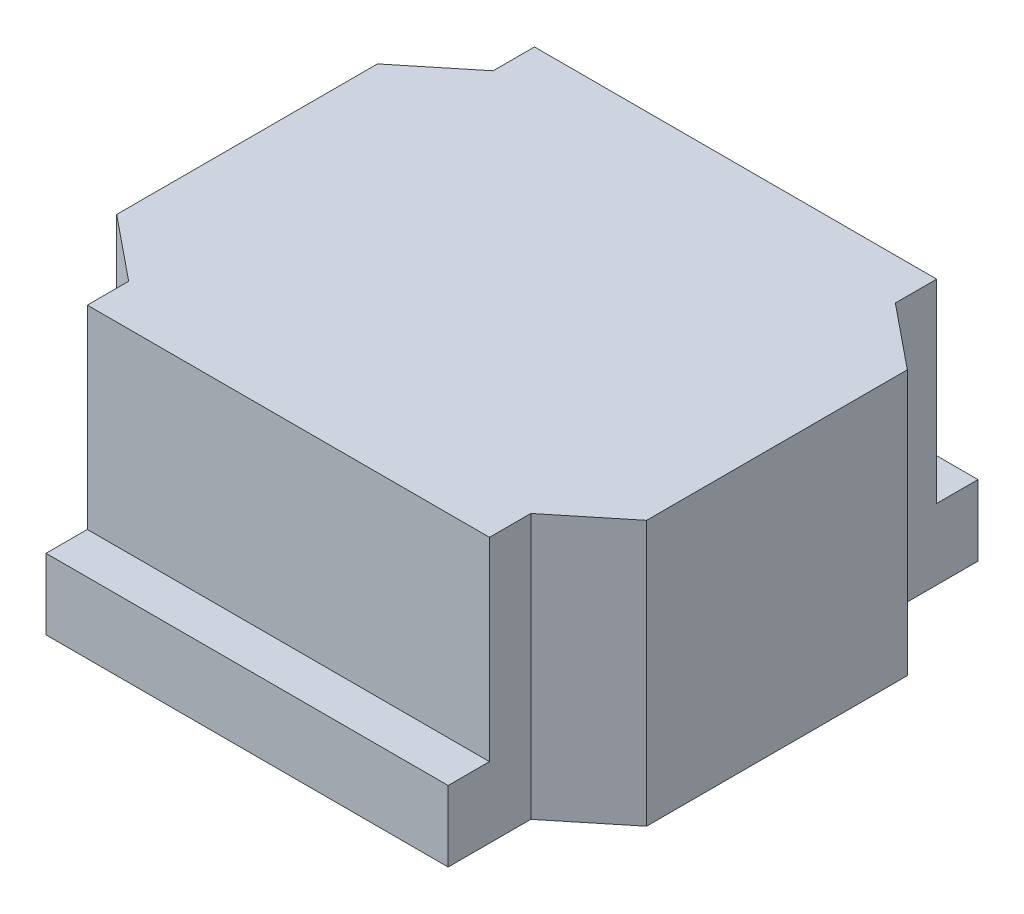
ISO-10303-21;
HEADER;
FILE_DESCRIPTION(('STEP AP214'),'2;1');
FILE_NAME('part.step','',(''),(''),'','','');
FILE_SCHEMA(('AUTOMOTIVE_DESIGN { 1 0 10303 214 1 1 1 1 }'));
ENDSEC;
DATA;
#1=APPLICATION_CONTEXT('core data for automotive mechanical design processes');
#2=APPLICATION_PROTOCOL_DEFINITION('international standard','automotive_design',2000,#1);
#3=PRODUCT_CONTEXT('',#1,'mechanical');
#4=PRODUCT('Part','Part','',(#3));
#5=PRODUCT_RELATED_PRODUCT_CATEGORY('part','',(#4));
#6=PRODUCT_DEFINITION_FORMATION('','',#4);
#7=PRODUCT_DEFINITION_CONTEXT('part definition',#1,'design');
#8=PRODUCT_DEFINITION('design','',#6,#7);
#9=PRODUCT_DEFINITION_SHAPE('','',#8);
#10=(LENGTH_UNIT() NAMED_UNIT(*) SI_UNIT(.MILLI.,.METRE.));
#11=(NAMED_UNIT(*) PLANE_ANGLE_UNIT() SI_UNIT($,.RADIAN.));
#12=(NAMED_UNIT(*) SI_UNIT($,.STERADIAN.) SOLID_ANGLE_UNIT());
#13=UNCERTAINTY_MEASURE_WITH_UNIT(LENGTH_MEASURE(1.E-05),#10,'distance_accuracy_value','');
#14=(GEOMETRIC_REPRESENTATION_CONTEXT(3) GLOBAL_UNCERTAINTY_ASSIGNED_CONTEXT((#13)) GLOBAL_UNIT_ASSIGNED_CONTEXT((#10,
#11,#12)) REPRESENTATION_CONTEXT('',''));
#15=CARTESIAN_POINT('',(0.,0.,0.));
#16=DIRECTION('',(0.,0.,1.));
#17=DIRECTION('',(1.,0.,0.));
#18=AXIS2_PLACEMENT_3D('',#15,#16,#17);
#19=CARTESIAN_POINT('',(0.,1.5,0.));
#20=DIRECTION('',(0.,1.,0.));
#21=DIRECTION('',(0.,0.,1.));
#22=AXIS2_PLACEMENT_3D('',#19,#20,#21);
#23=PLANE('',#22);
#24=DIRECTION('',(-0.776051768896071,0.,0.630669209644231));
#25=VECTOR('',#24,1.);
#26=CARTESIAN_POINT('',(-1.138546216739,1.5,-1.03198911933));
#27=LINE('',#26,#25);
#28=CARTESIAN_POINT('',(-1.13854621673901,1.5,-1.03198911933001));
#29=VERTEX_POINT('',#28);
#30=CARTESIAN_POINT('',(-1.5,1.5,-0.7382487002644));
#31=VERTEX_POINT('',#30);
#32=EDGE_CURVE('E136',#29,#31,#27,.T.);
#33=ORIENTED_EDGE('',*,*,#32,.T.);
#34=DIRECTION('',(0.,0.,1.));
#35=VECTOR('',#34,1.);
#36=CARTESIAN_POINT('',(-1.5,1.5,0.));
#37=LINE('',#36,#35);
#38=CARTESIAN_POINT('',(-1.49999999999999,1.5,0.738248700264391));
#39=VERTEX_POINT('',#38);
#40=EDGE_CURVE('E130',#31,#39,#37,.T.);
#41=ORIENTED_EDGE('',*,*,#40,.T.);
#42=DIRECTION('',(0.776051768896071,0.,0.630669209644231));
#43=VECTOR('',#42,1.);
#44=CARTESIAN_POINT('',(-1.5,1.5,0.7382487002644));
#45=LINE('',#44,#43);
#46=CARTESIAN_POINT('',(-1.138546216739,1.5,1.03198911933));
#47=VERTEX_POINT('',#46);
#48=EDGE_CURVE('E20',#39,#47,#45,.T.);
#49=ORIENTED_EDGE('',*,*,#48,.T.);
#50=DIRECTION('',(0.,0.,-1.));
#51=VECTOR('',#50,1.);
#52=CARTESIAN_POINT('',(-1.138546216739,1.5,1.5));
#53=LINE('',#52,#51);
#54=CARTESIAN_POINT('',(-1.138546216739,1.5,1.265994559665));
#55=VERTEX_POINT('',#54);
#56=EDGE_CURVE('E140',#47,#55,#53,.F.);
#57=ORIENTED_EDGE('',*,*,#56,.T.);
#58=DIRECTION('',(1.,0.,0.));
#59=VECTOR('',#58,1.);
#60=CARTESIAN_POINT('',(-1.138546216739,1.5,1.265994559665));
#61=LINE('',#60,#59);
#62=CARTESIAN_POINT('',(1.138546216739,1.5,1.265994559665));
#63=VERTEX_POINT('',#62);
#64=EDGE_CURVE('E182',#63,#55,#61,.F.);
#65=ORIENTED_EDGE('',*,*,#64,.F.);
#66=DIRECTION('',(0.,0.,1.));
#67=VECTOR('',#66,1.);
#68=CARTESIAN_POINT('',(1.138546216739,1.5,1.03198911933));
#69=LINE('',#68,#67);
#70=CARTESIAN_POINT('',(1.13854621673901,1.5,1.03198911933001));
#71=VERTEX_POINT('',#70);
#72=EDGE_CURVE('E201',#63,#71,#69,.F.);
#73=ORIENTED_EDGE('',*,*,#72,.T.);
#74=DIRECTION('',(0.776051768896071,0.,-0.630669209644231));
#75=VECTOR('',#74,1.);
#76=CARTESIAN_POINT('',(1.138546216739,1.5,1.03198911933));
#77=LINE('',#76,#75);
#78=CARTESIAN_POINT('',(1.5,1.5,0.7382487002644));
#79=VERTEX_POINT('',#78);
#80=EDGE_CURVE('E126',#71,#79,#77,.T.);
#81=ORIENTED_EDGE('',*,*,#80,.T.);
#82=DIRECTION('',(0.,0.,1.));
#83=VECTOR('',#82,1.);
#84=CARTESIAN_POINT('',(1.5,1.5,0.));
#85=LINE('',#84,#83);
#86=CARTESIAN_POINT('',(1.49999999999999,1.5,-0.738248700264391));
#87=VERTEX_POINT('',#86);
#88=EDGE_CURVE('E157',#79,#87,#85,.F.);
#89=ORIENTED_EDGE('',*,*,#88,.T.);
#90=DIRECTION('',(-0.776051768896071,0.,-0.630669209644231));
#91=VECTOR('',#90,1.);
#92=CARTESIAN_POINT('',(1.5,1.5,-0.7382487002644));
#93=LINE('',#92,#91);
#94=CARTESIAN_POINT('',(1.138546216739,1.5,-1.03198911933));
#95=VERTEX_POINT('',#94);
#96=EDGE_CURVE('E158',#87,#95,#93,.T.);
#97=ORIENTED_EDGE('',*,*,#96,.T.);
#98=DIRECTION('',(0.,0.,1.));
#99=VECTOR('',#98,1.);
#100=CARTESIAN_POINT('',(1.138546216739,1.5,-1.5));
#101=LINE('',#100,#99);
#102=CARTESIAN_POINT('',(1.138546216739,1.5,-1.265994559665));
#103=VERTEX_POINT('',#102);
#104=EDGE_CURVE('E187',#95,#103,#101,.F.);
#105=ORIENTED_EDGE('',*,*,#104,.T.);
#106=DIRECTION('',(-1.,0.,0.));
#107=VECTOR('',#106,1.);
#108=CARTESIAN_POINT('',(1.138546216739,1.5,-1.265994559665));
#109=LINE('',#108,#107);
#110=CARTESIAN_POINT('',(-1.138546216739,1.5,-1.265994559665));
#111=VERTEX_POINT('',#110);
#112=EDGE_CURVE('E211',#111,#103,#109,.F.);
#113=ORIENTED_EDGE('',*,*,#112,.F.);
#114=DIRECTION('',(0.,0.,-1.));
#115=VECTOR('',#114,1.);
#116=CARTESIAN_POINT('',(-1.138546216739,1.5,-1.03198911933));
#117=LINE('',#116,#115);
#118=EDGE_CURVE('E174',#111,#29,#117,.F.);
#119=ORIENTED_EDGE('',*,*,#118,.T.);
#120=EDGE_LOOP('',(#33,#41,#49,#57,#65,#73,#81,#89,#97,#105,#113,#119));
#121=FACE_BOUND('',#120,.T.);
#122=ADVANCED_FACE('F17',(#121),#23,.T.);
#123=CARTESIAN_POINT('',(-1.138546216739,0.4,1.5));
#124=DIRECTION('',(1.,0.,0.));
#125=DIRECTION('',(0.,0.,-1.));
#126=AXIS2_PLACEMENT_3D('',#123,#124,#125);
#127=PLANE('',#126);
#128=DIRECTION('',(0.,1.,0.));
#129=VECTOR('',#128,1.);
#130=CARTESIAN_POINT('',(-1.138546216739,0.4,1.5));
#131=LINE('',#130,#129);
#132=CARTESIAN_POINT('',(-1.138546216739,0.4,1.5));
#133=VERTEX_POINT('',#132);
#134=CARTESIAN_POINT('',(-1.138546216739,0.,1.5));
#135=VERTEX_POINT('',#134);
#136=EDGE_CURVE('E167',#133,#135,#131,.F.);
#137=ORIENTED_EDGE('',*,*,#136,.F.);
#138=DIRECTION('',(0.,0.,-1.));
#139=VECTOR('',#138,1.);
#140=CARTESIAN_POINT('',(-1.138546216739,0.4,1.5));
#141=LINE('',#140,#139);
#142=CARTESIAN_POINT('',(-1.138546216739,0.4,1.265994559665));
#143=VERTEX_POINT('',#142);
#144=EDGE_CURVE('E164',#143,#133,#141,.F.);
#145=ORIENTED_EDGE('',*,*,#144,.F.);
#146=DIRECTION('',(0.,1.,0.));
#147=VECTOR('',#146,1.);
#148=CARTESIAN_POINT('',(-1.138546216739,0.4,1.265994559665));
#149=LINE('',#148,#147);
#150=EDGE_CURVE('E184',#55,#143,#149,.F.);
#151=ORIENTED_EDGE('',*,*,#150,.F.);
#152=ORIENTED_EDGE('',*,*,#56,.F.);
#153=DIRECTION('',(0.,1.,0.));
#154=VECTOR('',#153,1.);
#155=CARTESIAN_POINT('',(-1.138546216739,0.4,1.03198911933));
#156=LINE('',#155,#154);
#157=CARTESIAN_POINT('',(-1.138546216739,0.,1.03198911933));
#158=VERTEX_POINT('',#157);
#159=EDGE_CURVE('E156',#47,#158,#156,.F.);
#160=ORIENTED_EDGE('',*,*,#159,.T.);
#161=DIRECTION('',(0.,0.,-1.));
#162=VECTOR('',#161,1.);
#163=CARTESIAN_POINT('',(-1.138546216739,0.,1.5));
#164=LINE('',#163,#162);
#165=EDGE_CURVE('E170',#135,#158,#164,.T.);
#166=ORIENTED_EDGE('',*,*,#165,.F.);
#167=EDGE_LOOP('',(#137,#145,#151,#152,#160,#166));
#168=FACE_BOUND('',#167,.T.);
#169=ADVANCED_FACE('F279',(#168),#127,.F.);
#170=CARTESIAN_POINT('',(-1.138546216739,0.4,-1.03198911933));
#171=DIRECTION('',(1.,0.,0.));
#172=DIRECTION('',(0.,0.,-1.));
#173=AXIS2_PLACEMENT_3D('',#170,#171,#172);
#174=PLANE('',#173);
#175=DIRECTION('',(0.,0.,-1.));
#176=VECTOR('',#175,1.);
#177=CARTESIAN_POINT('',(-1.138546216739,0.,-1.03198911933));
#178=LINE('',#177,#176);
#179=CARTESIAN_POINT('',(-1.13854621673901,0.,-1.03198911933001));
#180=VERTEX_POINT('',#179);
#181=CARTESIAN_POINT('',(-1.138546216739,0.,-1.5));
#182=VERTEX_POINT('',#181);
#183=EDGE_CURVE('E176',#180,#182,#178,.T.);
#184=ORIENTED_EDGE('',*,*,#183,.F.);
#185=DIRECTION('',(0.,1.,0.));
#186=VECTOR('',#185,1.);
#187=CARTESIAN_POINT('',(-1.13854621673903,0.4,-1.03198911933004));
#188=LINE('',#187,#186);
#189=EDGE_CURVE('E219',#180,#29,#188,.T.);
#190=ORIENTED_EDGE('',*,*,#189,.T.);
#191=ORIENTED_EDGE('',*,*,#118,.F.);
#192=DIRECTION('',(0.,1.,0.));
#193=VECTOR('',#192,1.);
#194=CARTESIAN_POINT('',(-1.138546216739,0.4,-1.265994559665));
#195=LINE('',#194,#193);
#196=CARTESIAN_POINT('',(-1.138546216739,0.4,-1.265994559665));
#197=VERTEX_POINT('',#196);
#198=EDGE_CURVE('E208',#197,#111,#195,.T.);
#199=ORIENTED_EDGE('',*,*,#198,.F.);
#200=DIRECTION('',(0.,0.,-1.));
#201=VECTOR('',#200,1.);
#202=CARTESIAN_POINT('',(-1.138546216739,0.4,-1.03198911933));
#203=LINE('',#202,#201);
#204=CARTESIAN_POINT('',(-1.138546216739,0.4,-1.5));
#205=VERTEX_POINT('',#204);
#206=EDGE_CURVE('E172',#205,#197,#203,.F.);
#207=ORIENTED_EDGE('',*,*,#206,.F.);
#208=DIRECTION('',(0.,1.,0.));
#209=VECTOR('',#208,1.);
#210=CARTESIAN_POINT('',(-1.138546216739,0.4,-1.5));
#211=LINE('',#210,#209);
#212=EDGE_CURVE('E179',#182,#205,#211,.T.);
#213=ORIENTED_EDGE('',*,*,#212,.F.);
#214=EDGE_LOOP('',(#184,#190,#191,#199,#207,#213));
#215=FACE_BOUND('',#214,.T.);
#216=ADVANCED_FACE('F419',(#215),#174,.F.);
#217=CARTESIAN_POINT('',(-1.138546216739,0.4,1.265994559665));
#218=DIRECTION('',(0.,0.,1.));
#219=DIRECTION('',(1.,0.,0.));
#220=AXIS2_PLACEMENT_3D('',#217,#218,#219);
#221=PLANE('',#220);
#222=ORIENTED_EDGE('',*,*,#150,.T.);
#223=DIRECTION('',(1.,0.,0.));
#224=VECTOR('',#223,1.);
#225=CARTESIAN_POINT('',(0.,0.4,1.265994559665));
#226=LINE('',#225,#224);
#227=CARTESIAN_POINT('',(1.138546216739,0.4,1.265994559665));
#228=VERTEX_POINT('',#227);
#229=EDGE_CURVE('E228',#228,#143,#226,.F.);
#230=ORIENTED_EDGE('',*,*,#229,.F.);
#231=DIRECTION('',(0.,1.,0.));
#232=VECTOR('',#231,1.);
#233=CARTESIAN_POINT('',(1.138546216739,0.4,1.265994559665));
#234=LINE('',#233,#232);
#235=EDGE_CURVE('E198',#228,#63,#234,.T.);
#236=ORIENTED_EDGE('',*,*,#235,.T.);
#237=ORIENTED_EDGE('',*,*,#64,.T.);
#238=EDGE_LOOP('',(#222,#230,#236,#237));
#239=FACE_BOUND('',#238,.T.);
#240=ADVANCED_FACE('F282',(#239),#221,.T.);
#241=CARTESIAN_POINT('',(1.138546216739,0.4,-1.5));
#242=DIRECTION('',(-1.,0.,0.));
#243=DIRECTION('',(0.,0.,1.));
#244=AXIS2_PLACEMENT_3D('',#241,#242,#243);
#245=PLANE('',#244);
#246=DIRECTION('',(0.,1.,0.));
#247=VECTOR('',#246,1.);
#248=CARTESIAN_POINT('',(1.138546216739,0.4,-1.5));
#249=LINE('',#248,#247);
#250=CARTESIAN_POINT('',(1.138546216739,0.4,-1.5));
#251=VERTEX_POINT('',#250);
#252=CARTESIAN_POINT('',(1.138546216739,0.,-1.5));
#253=VERTEX_POINT('',#252);
#254=EDGE_CURVE('E193',#251,#253,#249,.F.);
#255=ORIENTED_EDGE('',*,*,#254,.F.);
#256=DIRECTION('',(0.,0.,1.));
#257=VECTOR('',#256,1.);
#258=CARTESIAN_POINT('',(1.138546216739,0.4,-1.5));
#259=LINE('',#258,#257);
#260=CARTESIAN_POINT('',(1.138546216739,0.4,-1.265994559665));
#261=VERTEX_POINT('',#260);
#262=EDGE_CURVE('E190',#261,#251,#259,.F.);
#263=ORIENTED_EDGE('',*,*,#262,.F.);
#264=DIRECTION('',(0.,1.,0.));
#265=VECTOR('',#264,1.);
#266=CARTESIAN_POINT('',(1.138546216739,0.4,-1.265994559665));
#267=LINE('',#266,#265);
#268=EDGE_CURVE('E213',#103,#261,#267,.F.);
#269=ORIENTED_EDGE('',*,*,#268,.F.);
#270=ORIENTED_EDGE('',*,*,#104,.F.);
#271=DIRECTION('',(0.,1.,0.));
#272=VECTOR('',#271,1.);
#273=CARTESIAN_POINT('',(1.138546216739,0.4,-1.03198911933));
#274=LINE('',#273,#272);
#275=CARTESIAN_POINT('',(1.138546216739,0.,-1.03198911933));
#276=VERTEX_POINT('',#275);
#277=EDGE_CURVE('E231',#95,#276,#274,.F.);
#278=ORIENTED_EDGE('',*,*,#277,.T.);
#279=DIRECTION('',(0.,0.,1.));
#280=VECTOR('',#279,1.);
#281=CARTESIAN_POINT('',(1.138546216739,0.,-1.5));
#282=LINE('',#281,#280);
#283=EDGE_CURVE('E196',#253,#276,#282,.T.);
#284=ORIENTED_EDGE('',*,*,#283,.F.);
#285=EDGE_LOOP('',(#255,#263,#269,#270,#278,#284));
#286=FACE_BOUND('',#285,.T.);
#287=ADVANCED_FACE('F403',(#286),#245,.F.);
#288=CARTESIAN_POINT('',(1.138546216739,0.4,1.03198911933));
#289=DIRECTION('',(-1.,0.,0.));
#290=DIRECTION('',(0.,0.,1.));
#291=AXIS2_PLACEMENT_3D('',#288,#289,#290);
#292=PLANE('',#291);
#293=DIRECTION('',(0.,0.,1.));
#294=VECTOR('',#293,1.);
#295=CARTESIAN_POINT('',(1.138546216739,0.,1.03198911933));
#296=LINE('',#295,#294);
#297=CARTESIAN_POINT('',(1.13854621673901,0.,1.03198911933001));
#298=VERTEX_POINT('',#297);
#299=CARTESIAN_POINT('',(1.138546216739,0.,1.5));
#300=VERTEX_POINT('',#299);
#301=EDGE_CURVE('E203',#298,#300,#296,.T.);
#302=ORIENTED_EDGE('',*,*,#301,.F.);
#303=DIRECTION('',(0.,1.,0.));
#304=VECTOR('',#303,1.);
#305=CARTESIAN_POINT('',(1.13854621673903,0.4,1.03198911933004));
#306=LINE('',#305,#304);
#307=EDGE_CURVE('E235',#298,#71,#306,.T.);
#308=ORIENTED_EDGE('',*,*,#307,.T.);
#309=ORIENTED_EDGE('',*,*,#72,.F.);
#310=ORIENTED_EDGE('',*,*,#235,.F.);
#311=DIRECTION('',(0.,0.,1.));
#312=VECTOR('',#311,1.);
#313=CARTESIAN_POINT('',(1.138546216739,0.4,0.));
#314=LINE('',#313,#312);
#315=CARTESIAN_POINT('',(1.138546216739,0.4,1.5));
#316=VERTEX_POINT('',#315);
#317=EDGE_CURVE('E225',#316,#228,#314,.F.);
#318=ORIENTED_EDGE('',*,*,#317,.F.);
#319=DIRECTION('',(0.,1.,0.));
#320=VECTOR('',#319,1.);
#321=CARTESIAN_POINT('',(1.138546216739,0.4,1.5));
#322=LINE('',#321,#320);
#323=EDGE_CURVE('E206',#300,#316,#322,.T.);
#324=ORIENTED_EDGE('',*,*,#323,.F.);
#325=EDGE_LOOP('',(#302,#308,#309,#310,#318,#324));
#326=FACE_BOUND('',#325,.T.);
#327=ADVANCED_FACE('F273',(#326),#292,.F.);
#328=CARTESIAN_POINT('',(1.138546216739,0.4,-1.265994559665));
#329=DIRECTION('',(0.,0.,-1.));
#330=DIRECTION('',(-1.,0.,0.));
#331=AXIS2_PLACEMENT_3D('',#328,#329,#330);
#332=PLANE('',#331);
#333=ORIENTED_EDGE('',*,*,#268,.T.);
#334=DIRECTION('',(1.,0.,0.));
#335=VECTOR('',#334,1.);
#336=CARTESIAN_POINT('',(0.,0.4,-1.265994559665));
#337=LINE('',#336,#335);
#338=EDGE_CURVE('E151',#197,#261,#337,.T.);
#339=ORIENTED_EDGE('',*,*,#338,.F.);
#340=ORIENTED_EDGE('',*,*,#198,.T.);
#341=ORIENTED_EDGE('',*,*,#112,.T.);
#342=EDGE_LOOP('',(#333,#339,#340,#341));
#343=FACE_BOUND('',#342,.T.);
#344=ADVANCED_FACE('F387',(#343),#332,.T.);
#345=CARTESIAN_POINT('',(-1.138546216739,0.4,1.03198911933));
#346=DIRECTION('',(0.630669209644307,0.,-0.776051768896009));
#347=DIRECTION('',(-0.776051768896009,0.,-0.630669209644307));
#348=AXIS2_PLACEMENT_3D('',#345,#346,#347);
#349=PLANE('',#348);
#350=ORIENTED_EDGE('',*,*,#159,.F.);
#351=ORIENTED_EDGE('',*,*,#48,.F.);
#352=DIRECTION('',(0.,1.,0.));
#353=VECTOR('',#352,1.);
#354=CARTESIAN_POINT('',(-1.5,0.,0.7382487002644));
#355=LINE('',#354,#353);
#356=CARTESIAN_POINT('',(-1.49999999999999,0.,0.738248700264382));
#357=VERTEX_POINT('',#356);
#358=EDGE_CURVE('E144',#357,#39,#355,.T.);
#359=ORIENTED_EDGE('',*,*,#358,.F.);
#360=DIRECTION('',(-0.776051768896009,0.,-0.630669209644307));
#361=VECTOR('',#360,1.);
#362=CARTESIAN_POINT('',(-1.138546216739,0.,1.03198911933));
#363=LINE('',#362,#361);
#364=EDGE_CURVE('E217',#158,#357,#363,.T.);
#365=ORIENTED_EDGE('',*,*,#364,.F.);
#366=EDGE_LOOP('',(#350,#351,#359,#365));
#367=FACE_BOUND('',#366,.T.);
#368=ADVANCED_FACE('F154',(#367),#349,.F.);
#369=CARTESIAN_POINT('',(-1.5,0.4,-0.7382487002644));
#370=DIRECTION('',(0.630669209644307,0.,0.776051768896009));
#371=DIRECTION('',(0.776051768896009,0.,-0.630669209644307));
#372=AXIS2_PLACEMENT_3D('',#369,#370,#371);
#373=PLANE('',#372);
#374=DIRECTION('',(0.,1.,0.));
#375=VECTOR('',#374,1.);
#376=CARTESIAN_POINT('',(-1.5,0.,-0.7382487002644));
#377=LINE('',#376,#375);
#378=CARTESIAN_POINT('',(-1.5,0.,-0.7382487002644));
#379=VERTEX_POINT('',#378);
#380=EDGE_CURVE('E150',#31,#379,#377,.F.);
#381=ORIENTED_EDGE('',*,*,#380,.F.);
#382=ORIENTED_EDGE('',*,*,#32,.F.);
#383=ORIENTED_EDGE('',*,*,#189,.F.);
#384=DIRECTION('',(0.776051768896009,0.,-0.630669209644307));
#385=VECTOR('',#384,1.);
#386=CARTESIAN_POINT('',(-1.5,0.,-0.7382487002644));
#387=LINE('',#386,#385);
#388=EDGE_CURVE('E222',#379,#180,#387,.T.);
#389=ORIENTED_EDGE('',*,*,#388,.F.);
#390=EDGE_LOOP('',(#381,#382,#383,#389));
#391=FACE_BOUND('',#390,.T.);
#392=ADVANCED_FACE('F288',(#391),#373,.F.);
#393=CARTESIAN_POINT('',(0.,0.4,0.));
#394=DIRECTION('',(0.,1.,0.));
#395=DIRECTION('',(0.,0.,1.));
#396=AXIS2_PLACEMENT_3D('',#393,#394,#395);
#397=PLANE('',#396);
#398=ORIENTED_EDGE('',*,*,#317,.T.);
#399=ORIENTED_EDGE('',*,*,#229,.T.);
#400=ORIENTED_EDGE('',*,*,#144,.T.);
#401=DIRECTION('',(1.,0.,0.));
#402=VECTOR('',#401,1.);
#403=CARTESIAN_POINT('',(-1.5,0.4,1.5));
#404=LINE('',#403,#402);
#405=EDGE_CURVE('E244',#316,#133,#404,.F.);
#406=ORIENTED_EDGE('',*,*,#405,.F.);
#407=EDGE_LOOP('',(#398,#399,#400,#406));
#408=FACE_BOUND('',#407,.T.);
#409=ADVANCED_FACE('F285',(#408),#397,.T.);
#410=CARTESIAN_POINT('',(1.138546216739,0.4,-1.03198911933));
#411=DIRECTION('',(-0.630669209644307,0.,0.776051768896009));
#412=DIRECTION('',(0.776051768896009,0.,0.630669209644307));
#413=AXIS2_PLACEMENT_3D('',#410,#411,#412);
#414=PLANE('',#413);
#415=ORIENTED_EDGE('',*,*,#277,.F.);
#416=ORIENTED_EDGE('',*,*,#96,.F.);
#417=DIRECTION('',(0.,1.,0.));
#418=VECTOR('',#417,1.);
#419=CARTESIAN_POINT('',(1.5,0.,-0.7382487002644));
#420=LINE('',#419,#418);
#421=CARTESIAN_POINT('',(1.49999999999999,0.,-0.738248700264382));
#422=VERTEX_POINT('',#421);
#423=EDGE_CURVE('E247',#422,#87,#420,.T.);
#424=ORIENTED_EDGE('',*,*,#423,.F.);
#425=DIRECTION('',(0.776051768896009,0.,0.630669209644307));
#426=VECTOR('',#425,1.);
#427=CARTESIAN_POINT('',(1.138546216739,0.,-1.03198911933));
#428=LINE('',#427,#426);
#429=EDGE_CURVE('E35',#276,#422,#428,.T.);
#430=ORIENTED_EDGE('',*,*,#429,.F.);
#431=EDGE_LOOP('',(#415,#416,#424,#430));
#432=FACE_BOUND('',#431,.T.);
#433=ADVANCED_FACE('F287',(#432),#414,.F.);
#434=CARTESIAN_POINT('',(1.5,0.4,0.7382487002644));
#435=DIRECTION('',(-0.630669209644307,0.,-0.776051768896009));
#436=DIRECTION('',(-0.776051768896009,0.,0.630669209644307));
#437=AXIS2_PLACEMENT_3D('',#434,#435,#436);
#438=PLANE('',#437);
#439=DIRECTION('',(0.,1.,0.));
#440=VECTOR('',#439,1.);
#441=CARTESIAN_POINT('',(1.5,0.,0.7382487002644));
#442=LINE('',#441,#440);
#443=CARTESIAN_POINT('',(1.5,0.,0.7382487002644));
#444=VERTEX_POINT('',#443);
#445=EDGE_CURVE('E250',#79,#444,#442,.F.);
#446=ORIENTED_EDGE('',*,*,#445,.F.);
#447=ORIENTED_EDGE('',*,*,#80,.F.);
#448=ORIENTED_EDGE('',*,*,#307,.F.);
#449=DIRECTION('',(-0.776051768896009,0.,0.630669209644307));
#450=VECTOR('',#449,1.);
#451=CARTESIAN_POINT('',(1.5,0.,0.7382487002644));
#452=LINE('',#451,#450);
#453=EDGE_CURVE('E238',#444,#298,#452,.T.);
#454=ORIENTED_EDGE('',*,*,#453,.F.);
#455=EDGE_LOOP('',(#446,#447,#448,#454));
#456=FACE_BOUND('',#455,.T.);
#457=ADVANCED_FACE('F270',(#456),#438,.F.);
#458=CARTESIAN_POINT('',(0.,0.4,0.));
#459=DIRECTION('',(0.,1.,0.));
#460=DIRECTION('',(0.,0.,1.));
#461=AXIS2_PLACEMENT_3D('',#458,#459,#460);
#462=PLANE('',#461);
#463=ORIENTED_EDGE('',*,*,#206,.T.);
#464=ORIENTED_EDGE('',*,*,#338,.T.);
#465=ORIENTED_EDGE('',*,*,#262,.T.);
#466=DIRECTION('',(-1.,0.,0.));
#467=VECTOR('',#466,1.);
#468=CARTESIAN_POINT('',(1.5,0.4,-1.5));
#469=LINE('',#468,#467);
#470=EDGE_CURVE('E253',#205,#251,#469,.F.);
#471=ORIENTED_EDGE('',*,*,#470,.F.);
#472=EDGE_LOOP('',(#463,#464,#465,#471));
#473=FACE_BOUND('',#472,.T.);
#474=ADVANCED_FACE('F314',(#473),#462,.T.);
#475=CARTESIAN_POINT('',(-1.5,0.,-1.5));
#476=DIRECTION('',(-1.,0.,0.));
#477=DIRECTION('',(0.,0.,1.));
#478=AXIS2_PLACEMENT_3D('',#475,#476,#477);
#479=PLANE('',#478);
#480=ORIENTED_EDGE('',*,*,#40,.F.);
#481=ORIENTED_EDGE('',*,*,#380,.T.);
#482=DIRECTION('',(0.,0.,1.));
#483=VECTOR('',#482,1.);
#484=CARTESIAN_POINT('',(-1.5,0.,0.));
#485=LINE('',#484,#483);
#486=EDGE_CURVE('E147',#379,#357,#485,.T.);
#487=ORIENTED_EDGE('',*,*,#486,.T.);
#488=ORIENTED_EDGE('',*,*,#358,.T.);
#489=EDGE_LOOP('',(#480,#481,#487,#488));
#490=FACE_BOUND('',#489,.T.);
#491=ADVANCED_FACE('F145',(#490),#479,.T.);
#492=CARTESIAN_POINT('',(-1.5,0.,1.5));
#493=DIRECTION('',(0.,0.,1.));
#494=DIRECTION('',(1.,0.,0.));
#495=AXIS2_PLACEMENT_3D('',#492,#493,#494);
#496=PLANE('',#495);
#497=DIRECTION('',(1.,0.,0.));
#498=VECTOR('',#497,1.);
#499=CARTESIAN_POINT('',(0.,0.,1.5));
#500=LINE('',#499,#498);
#501=EDGE_CURVE('E257',#135,#300,#500,.T.);
#502=ORIENTED_EDGE('',*,*,#501,.T.);
#503=ORIENTED_EDGE('',*,*,#323,.T.);
#504=ORIENTED_EDGE('',*,*,#405,.T.);
#505=ORIENTED_EDGE('',*,*,#136,.T.);
#506=EDGE_LOOP('',(#502,#503,#504,#505));
#507=FACE_BOUND('',#506,.T.);
#508=ADVANCED_FACE('F277',(#507),#496,.T.);
#509=CARTESIAN_POINT('',(1.5,0.,1.5));
#510=DIRECTION('',(1.,0.,0.));
#511=DIRECTION('',(0.,0.,-1.));
#512=AXIS2_PLACEMENT_3D('',#509,#510,#511);
#513=PLANE('',#512);
#514=ORIENTED_EDGE('',*,*,#88,.F.);
#515=ORIENTED_EDGE('',*,*,#445,.T.);
#516=DIRECTION('',(0.,0.,1.));
#517=VECTOR('',#516,1.);
#518=CARTESIAN_POINT('',(1.5,0.,0.));
#519=LINE('',#518,#517);
#520=EDGE_CURVE('E26',#444,#422,#519,.F.);
#521=ORIENTED_EDGE('',*,*,#520,.T.);
#522=ORIENTED_EDGE('',*,*,#423,.T.);
#523=EDGE_LOOP('',(#514,#515,#521,#522));
#524=FACE_BOUND('',#523,.T.);
#525=ADVANCED_FACE('F263',(#524),#513,.T.);
#526=CARTESIAN_POINT('',(1.5,0.,-1.5));
#527=DIRECTION('',(0.,0.,-1.));
#528=DIRECTION('',(-1.,0.,0.));
#529=AXIS2_PLACEMENT_3D('',#526,#527,#528);
#530=PLANE('',#529);
#531=DIRECTION('',(1.,0.,0.));
#532=VECTOR('',#531,1.);
#533=CARTESIAN_POINT('',(0.,0.,-1.5));
#534=LINE('',#533,#532);
#535=EDGE_CURVE('E11',#253,#182,#534,.F.);
#536=ORIENTED_EDGE('',*,*,#535,.T.);
#537=ORIENTED_EDGE('',*,*,#212,.T.);
#538=ORIENTED_EDGE('',*,*,#470,.T.);
#539=ORIENTED_EDGE('',*,*,#254,.T.);
#540=EDGE_LOOP('',(#536,#537,#538,#539));
#541=FACE_BOUND('',#540,.T.);
#542=ADVANCED_FACE('F300',(#541),#530,.T.);
#543=CARTESIAN_POINT('',(0.,0.,0.));
#544=DIRECTION('',(0.,1.,0.));
#545=DIRECTION('',(0.,0.,1.));
#546=AXIS2_PLACEMENT_3D('',#543,#544,#545);
#547=PLANE('',#546);
#548=ORIENTED_EDGE('',*,*,#535,.F.);
#549=ORIENTED_EDGE('',*,*,#283,.T.);
#550=ORIENTED_EDGE('',*,*,#429,.T.);
#551=ORIENTED_EDGE('',*,*,#520,.F.);
#552=ORIENTED_EDGE('',*,*,#453,.T.);
#553=ORIENTED_EDGE('',*,*,#301,.T.);
#554=ORIENTED_EDGE('',*,*,#501,.F.);
#555=ORIENTED_EDGE('',*,*,#165,.T.);
#556=ORIENTED_EDGE('',*,*,#364,.T.);
#557=ORIENTED_EDGE('',*,*,#486,.F.);
#558=ORIENTED_EDGE('',*,*,#388,.T.);
#559=ORIENTED_EDGE('',*,*,#183,.T.);
#560=EDGE_LOOP('',(#548,#549,#550,#551,#552,#553,#554,#555,#556,#557,#558,#559));
#561=FACE_BOUND('',#560,.T.);
#562=ADVANCED_FACE('F266',(#561),#547,.F.);
#563=CLOSED_SHELL('',(#122,#169,#216,#240,#287,#327,#344,#368,#392,#409,#433,#457,#474,#491,
#508,#525,#542,#562));
#564=MANIFOLD_SOLID_BREP('B1',#563);
#565=ADVANCED_BREP_SHAPE_REPRESENTATION('',(#18,#564),#14);
#566=SHAPE_DEFINITION_REPRESENTATION(#9,#565);
ENDSEC;
END-ISO-10303-21;
